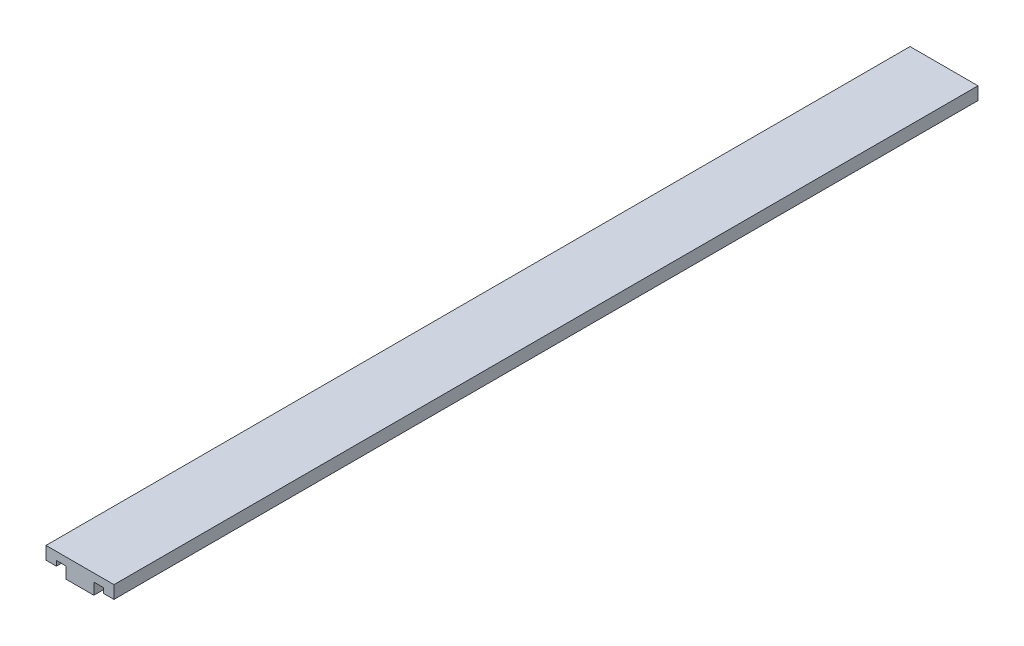
ISO-10303-21;
HEADER;
FILE_DESCRIPTION(('STEP AP214'),'2;1');
FILE_NAME('part.step','',(''),(''),'','','');
FILE_SCHEMA(('AUTOMOTIVE_DESIGN { 1 0 10303 214 1 1 1 1 }'));
ENDSEC;
DATA;
#1=APPLICATION_CONTEXT('core data for automotive mechanical design processes');
#2=APPLICATION_PROTOCOL_DEFINITION('international standard','automotive_design',2000,#1);
#3=PRODUCT_CONTEXT('',#1,'mechanical');
#4=PRODUCT('Part','Part','',(#3));
#5=PRODUCT_RELATED_PRODUCT_CATEGORY('part','',(#4));
#6=PRODUCT_DEFINITION_FORMATION('','',#4);
#7=PRODUCT_DEFINITION_CONTEXT('part definition',#1,'design');
#8=PRODUCT_DEFINITION('design','',#6,#7);
#9=PRODUCT_DEFINITION_SHAPE('','',#8);
#10=(LENGTH_UNIT() NAMED_UNIT(*) SI_UNIT(.MILLI.,.METRE.));
#11=(NAMED_UNIT(*) PLANE_ANGLE_UNIT() SI_UNIT($,.RADIAN.));
#12=(NAMED_UNIT(*) SI_UNIT($,.STERADIAN.) SOLID_ANGLE_UNIT());
#13=UNCERTAINTY_MEASURE_WITH_UNIT(LENGTH_MEASURE(1.E-05),#10,'distance_accuracy_value','');
#14=(GEOMETRIC_REPRESENTATION_CONTEXT(3) GLOBAL_UNCERTAINTY_ASSIGNED_CONTEXT((#13)) GLOBAL_UNIT_ASSIGNED_CONTEXT((#10,
#11,#12)) REPRESENTATION_CONTEXT('',''));
#15=CARTESIAN_POINT('',(0.,0.,0.));
#16=DIRECTION('',(0.,0.,1.));
#17=DIRECTION('',(1.,0.,0.));
#18=AXIS2_PLACEMENT_3D('',#15,#16,#17);
#19=CARTESIAN_POINT('',(-5.40005080000002,-33.5,-150.));
#20=DIRECTION('',(0.,-1.,0.));
#21=DIRECTION('',(0.,0.,-1.));
#22=AXIS2_PLACEMENT_3D('',#19,#20,#21);
#23=PLANE('',#22);
#24=DIRECTION('',(1.,0.,0.));
#25=VECTOR('',#24,1.);
#26=CARTESIAN_POINT('',(-5.40005080000002,-33.5,0.));
#27=LINE('',#26,#25);
#28=CARTESIAN_POINT('',(-5.40005080000002,-33.5,0.));
#29=VERTEX_POINT('',#28);
#30=CARTESIAN_POINT('',(-0.600050800000022,-33.5,0.));
#31=VERTEX_POINT('',#30);
#32=EDGE_CURVE('E154',#29,#31,#27,.T.);
#33=ORIENTED_EDGE('',*,*,#32,.F.);
#34=DIRECTION('',(0.,0.,1.));
#35=VECTOR('',#34,1.);
#36=CARTESIAN_POINT('',(-5.40005080000002,-33.5,-150.));
#37=LINE('',#36,#35);
#38=CARTESIAN_POINT('',(-5.40005080000002,-33.5,-150.));
#39=VERTEX_POINT('',#38);
#40=EDGE_CURVE('E11',#39,#29,#37,.T.);
#41=ORIENTED_EDGE('',*,*,#40,.F.);
#42=DIRECTION('',(1.,0.,0.));
#43=VECTOR('',#42,1.);
#44=CARTESIAN_POINT('',(-5.40005080000002,-33.5,-150.));
#45=LINE('',#44,#43);
#46=CARTESIAN_POINT('',(-0.600050800000022,-33.5,-150.));
#47=VERTEX_POINT('',#46);
#48=EDGE_CURVE('E186',#39,#47,#45,.T.);
#49=ORIENTED_EDGE('',*,*,#48,.T.);
#50=DIRECTION('',(0.,0.,1.));
#51=VECTOR('',#50,1.);
#52=CARTESIAN_POINT('',(-0.600050800000022,-33.5,-150.));
#53=LINE('',#52,#51);
#54=EDGE_CURVE('E36',#47,#31,#53,.T.);
#55=ORIENTED_EDGE('',*,*,#54,.T.);
#56=EDGE_LOOP('',(#33,#41,#49,#55));
#57=FACE_BOUND('',#56,.T.);
#58=ADVANCED_FACE('F33',(#57),#23,.T.);
#59=CARTESIAN_POINT('',(-5.40005080000002,-31.5104357389562,-150.));
#60=DIRECTION('',(-1.,0.,0.));
#61=DIRECTION('',(0.,0.,1.));
#62=AXIS2_PLACEMENT_3D('',#59,#60,#61);
#63=PLANE('',#62);
#64=DIRECTION('',(0.,-1.,0.));
#65=VECTOR('',#64,1.);
#66=CARTESIAN_POINT('',(-5.40005080000002,-31.5104357389562,0.));
#67=LINE('',#66,#65);
#68=CARTESIAN_POINT('',(-5.40005080000002,-31.5104357389562,0.));
#69=VERTEX_POINT('',#68);
#70=EDGE_CURVE('E184',#69,#29,#67,.T.);
#71=ORIENTED_EDGE('',*,*,#70,.F.);
#72=DIRECTION('',(0.,0.,1.));
#73=VECTOR('',#72,1.);
#74=CARTESIAN_POINT('',(-5.40005080000002,-31.5104357389562,-150.));
#75=LINE('',#74,#73);
#76=CARTESIAN_POINT('',(-5.40005080000002,-31.5104357389562,-150.));
#77=VERTEX_POINT('',#76);
#78=EDGE_CURVE('E42',#77,#69,#75,.T.);
#79=ORIENTED_EDGE('',*,*,#78,.F.);
#80=DIRECTION('',(0.,-1.,0.));
#81=VECTOR('',#80,1.);
#82=CARTESIAN_POINT('',(-5.40005080000002,-31.5104357389562,-150.));
#83=LINE('',#82,#81);
#84=EDGE_CURVE('E144',#77,#39,#83,.T.);
#85=ORIENTED_EDGE('',*,*,#84,.T.);
#86=ORIENTED_EDGE('',*,*,#40,.T.);
#87=EDGE_LOOP('',(#71,#79,#85,#86));
#88=FACE_BOUND('',#87,.T.);
#89=ADVANCED_FACE('F206',(#88),#63,.T.);
#90=CARTESIAN_POINT('',(-7.10005080000002,-31.5104357389562,-150.));
#91=DIRECTION('',(0.,-1.,0.));
#92=DIRECTION('',(0.,0.,-1.));
#93=AXIS2_PLACEMENT_3D('',#90,#91,#92);
#94=PLANE('',#93);
#95=DIRECTION('',(1.,0.,0.));
#96=VECTOR('',#95,1.);
#97=CARTESIAN_POINT('',(-7.10005080000002,-31.5104357389562,0.));
#98=LINE('',#97,#96);
#99=CARTESIAN_POINT('',(-7.10005080000002,-31.5104357389562,0.));
#100=VERTEX_POINT('',#99);
#101=EDGE_CURVE('E131',#100,#69,#98,.T.);
#102=ORIENTED_EDGE('',*,*,#101,.F.);
#103=DIRECTION('',(0.,0.,1.));
#104=VECTOR('',#103,1.);
#105=CARTESIAN_POINT('',(-7.10005080000002,-31.5104357389562,-150.));
#106=LINE('',#105,#104);
#107=CARTESIAN_POINT('',(-7.10005080000002,-31.5104357389562,-150.));
#108=VERTEX_POINT('',#107);
#109=EDGE_CURVE('E126',#108,#100,#106,.T.);
#110=ORIENTED_EDGE('',*,*,#109,.F.);
#111=DIRECTION('',(1.,0.,0.));
#112=VECTOR('',#111,1.);
#113=CARTESIAN_POINT('',(-7.10005080000002,-31.5104357389562,-150.));
#114=LINE('',#113,#112);
#115=EDGE_CURVE('E129',#108,#77,#114,.T.);
#116=ORIENTED_EDGE('',*,*,#115,.T.);
#117=ORIENTED_EDGE('',*,*,#78,.T.);
#118=EDGE_LOOP('',(#102,#110,#116,#117));
#119=FACE_BOUND('',#118,.T.);
#120=ADVANCED_FACE('F128',(#119),#94,.T.);
#121=CARTESIAN_POINT('',(-7.10005080000002,-32.3804332519096,-150.));
#122=DIRECTION('',(1.,0.,0.));
#123=DIRECTION('',(0.,0.,-1.));
#124=AXIS2_PLACEMENT_3D('',#121,#122,#123);
#125=PLANE('',#124);
#126=DIRECTION('',(0.,1.,0.));
#127=VECTOR('',#126,1.);
#128=CARTESIAN_POINT('',(-7.10005080000002,-32.3804332519096,0.));
#129=LINE('',#128,#127);
#130=CARTESIAN_POINT('',(-7.10005080000002,-32.3804332519096,0.));
#131=VERTEX_POINT('',#130);
#132=EDGE_CURVE('E181',#131,#100,#129,.T.);
#133=ORIENTED_EDGE('',*,*,#132,.F.);
#134=DIRECTION('',(0.,0.,1.));
#135=VECTOR('',#134,1.);
#136=CARTESIAN_POINT('',(-7.10005080000002,-32.3804332519096,-150.));
#137=LINE('',#136,#135);
#138=CARTESIAN_POINT('',(-7.10005080000002,-32.3804332519096,-150.));
#139=VERTEX_POINT('',#138);
#140=EDGE_CURVE('E136',#139,#131,#137,.T.);
#141=ORIENTED_EDGE('',*,*,#140,.F.);
#142=DIRECTION('',(0.,1.,0.));
#143=VECTOR('',#142,1.);
#144=CARTESIAN_POINT('',(-7.10005080000002,-32.3804332519096,-150.));
#145=LINE('',#144,#143);
#146=EDGE_CURVE('E142',#139,#108,#145,.T.);
#147=ORIENTED_EDGE('',*,*,#146,.T.);
#148=ORIENTED_EDGE('',*,*,#109,.T.);
#149=EDGE_LOOP('',(#133,#141,#147,#148));
#150=FACE_BOUND('',#149,.T.);
#151=ADVANCED_FACE('F146',(#150),#125,.T.);
#152=CARTESIAN_POINT('',(-8.90005080000002,-32.3804332519096,-150.));
#153=DIRECTION('',(0.,-1.,0.));
#154=DIRECTION('',(0.,0.,-1.));
#155=AXIS2_PLACEMENT_3D('',#152,#153,#154);
#156=PLANE('',#155);
#157=DIRECTION('',(1.,0.,0.));
#158=VECTOR('',#157,1.);
#159=CARTESIAN_POINT('',(-8.90005080000002,-32.3804332519096,0.));
#160=LINE('',#159,#158);
#161=CARTESIAN_POINT('',(-8.90005080000002,-32.3804332519096,0.));
#162=VERTEX_POINT('',#161);
#163=EDGE_CURVE('E178',#162,#131,#160,.T.);
#164=ORIENTED_EDGE('',*,*,#163,.F.);
#165=DIRECTION('',(0.,0.,1.));
#166=VECTOR('',#165,1.);
#167=CARTESIAN_POINT('',(-8.90005080000002,-32.3804332519096,-150.));
#168=LINE('',#167,#166);
#169=CARTESIAN_POINT('',(-8.90005080000002,-32.3804332519096,-150.));
#170=VERTEX_POINT('',#169);
#171=EDGE_CURVE('E190',#170,#162,#168,.T.);
#172=ORIENTED_EDGE('',*,*,#171,.F.);
#173=DIRECTION('',(1.,0.,0.));
#174=VECTOR('',#173,1.);
#175=CARTESIAN_POINT('',(-8.90005080000002,-32.3804332519096,-150.));
#176=LINE('',#175,#174);
#177=EDGE_CURVE('E147',#170,#139,#176,.T.);
#178=ORIENTED_EDGE('',*,*,#177,.T.);
#179=ORIENTED_EDGE('',*,*,#140,.T.);
#180=EDGE_LOOP('',(#164,#172,#178,#179));
#181=FACE_BOUND('',#180,.T.);
#182=ADVANCED_FACE('F219',(#181),#156,.T.);
#183=CARTESIAN_POINT('',(-8.90005080000002,-30.1504332519096,-150.));
#184=DIRECTION('',(-1.,0.,0.));
#185=DIRECTION('',(0.,0.,1.));
#186=AXIS2_PLACEMENT_3D('',#183,#184,#185);
#187=PLANE('',#186);
#188=DIRECTION('',(0.,-1.,0.));
#189=VECTOR('',#188,1.);
#190=CARTESIAN_POINT('',(-8.90005080000002,-30.1504332519096,0.));
#191=LINE('',#190,#189);
#192=CARTESIAN_POINT('',(-8.90005080000002,-30.1504332519096,0.));
#193=VERTEX_POINT('',#192);
#194=EDGE_CURVE('E175',#193,#162,#191,.T.);
#195=ORIENTED_EDGE('',*,*,#194,.F.);
#196=DIRECTION('',(0.,0.,1.));
#197=VECTOR('',#196,1.);
#198=CARTESIAN_POINT('',(-8.90005080000002,-30.1504332519096,-150.));
#199=LINE('',#198,#197);
#200=CARTESIAN_POINT('',(-8.90005080000002,-30.1504332519096,-150.));
#201=VERTEX_POINT('',#200);
#202=EDGE_CURVE('E192',#201,#193,#199,.T.);
#203=ORIENTED_EDGE('',*,*,#202,.F.);
#204=DIRECTION('',(0.,-1.,0.));
#205=VECTOR('',#204,1.);
#206=CARTESIAN_POINT('',(-8.90005080000002,-30.1504332519096,-150.));
#207=LINE('',#206,#205);
#208=EDGE_CURVE('E149',#201,#170,#207,.T.);
#209=ORIENTED_EDGE('',*,*,#208,.T.);
#210=ORIENTED_EDGE('',*,*,#171,.T.);
#211=EDGE_LOOP('',(#195,#203,#209,#210));
#212=FACE_BOUND('',#211,.T.);
#213=ADVANCED_FACE('F222',(#212),#187,.T.);
#214=CARTESIAN_POINT('',(2.89994919999997,-30.1504332519096,-150.));
#215=DIRECTION('',(0.,1.,0.));
#216=DIRECTION('',(0.,0.,1.));
#217=AXIS2_PLACEMENT_3D('',#214,#215,#216);
#218=PLANE('',#217);
#219=DIRECTION('',(-1.,0.,0.));
#220=VECTOR('',#219,1.);
#221=CARTESIAN_POINT('',(2.89994919999997,-30.1504332519096,0.));
#222=LINE('',#221,#220);
#223=CARTESIAN_POINT('',(2.89994919999997,-30.1504332519096,0.));
#224=VERTEX_POINT('',#223);
#225=EDGE_CURVE('E172',#224,#193,#222,.T.);
#226=ORIENTED_EDGE('',*,*,#225,.F.);
#227=DIRECTION('',(0.,0.,1.));
#228=VECTOR('',#227,1.);
#229=CARTESIAN_POINT('',(2.89994919999997,-30.1504332519096,-150.));
#230=LINE('',#229,#228);
#231=CARTESIAN_POINT('',(2.89994919999997,-30.1504332519096,-150.));
#232=VERTEX_POINT('',#231);
#233=EDGE_CURVE('E194',#232,#224,#230,.T.);
#234=ORIENTED_EDGE('',*,*,#233,.F.);
#235=DIRECTION('',(-1.,0.,0.));
#236=VECTOR('',#235,1.);
#237=CARTESIAN_POINT('',(2.89994919999997,-30.1504332519096,-150.));
#238=LINE('',#237,#236);
#239=EDGE_CURVE('E348',#232,#201,#238,.T.);
#240=ORIENTED_EDGE('',*,*,#239,.T.);
#241=ORIENTED_EDGE('',*,*,#202,.T.);
#242=EDGE_LOOP('',(#226,#234,#240,#241));
#243=FACE_BOUND('',#242,.T.);
#244=ADVANCED_FACE('F226',(#243),#218,.T.);
#245=CARTESIAN_POINT('',(2.89994919999997,-32.3804332519096,-150.));
#246=DIRECTION('',(1.,0.,0.));
#247=DIRECTION('',(0.,0.,-1.));
#248=AXIS2_PLACEMENT_3D('',#245,#246,#247);
#249=PLANE('',#248);
#250=DIRECTION('',(0.,1.,0.));
#251=VECTOR('',#250,1.);
#252=CARTESIAN_POINT('',(2.89994919999997,-32.3804332519096,0.));
#253=LINE('',#252,#251);
#254=CARTESIAN_POINT('',(2.89994919999997,-32.3804332519096,0.));
#255=VERTEX_POINT('',#254);
#256=EDGE_CURVE('E169',#255,#224,#253,.T.);
#257=ORIENTED_EDGE('',*,*,#256,.F.);
#258=DIRECTION('',(0.,0.,1.));
#259=VECTOR('',#258,1.);
#260=CARTESIAN_POINT('',(2.89994919999997,-32.3804332519096,-150.));
#261=LINE('',#260,#259);
#262=CARTESIAN_POINT('',(2.89994919999997,-32.3804332519096,-150.));
#263=VERTEX_POINT('',#262);
#264=EDGE_CURVE('E196',#263,#255,#261,.T.);
#265=ORIENTED_EDGE('',*,*,#264,.F.);
#266=DIRECTION('',(0.,1.,0.));
#267=VECTOR('',#266,1.);
#268=CARTESIAN_POINT('',(2.89994919999997,-32.3804332519096,-150.));
#269=LINE('',#268,#267);
#270=EDGE_CURVE('E352',#263,#232,#269,.T.);
#271=ORIENTED_EDGE('',*,*,#270,.T.);
#272=ORIENTED_EDGE('',*,*,#233,.T.);
#273=EDGE_LOOP('',(#257,#265,#271,#272));
#274=FACE_BOUND('',#273,.T.);
#275=ADVANCED_FACE('F230',(#274),#249,.T.);
#276=CARTESIAN_POINT('',(1.09994919999997,-32.3804332519096,-150.));
#277=DIRECTION('',(0.,-1.,0.));
#278=DIRECTION('',(0.,0.,-1.));
#279=AXIS2_PLACEMENT_3D('',#276,#277,#278);
#280=PLANE('',#279);
#281=DIRECTION('',(1.,0.,0.));
#282=VECTOR('',#281,1.);
#283=CARTESIAN_POINT('',(1.09994919999997,-32.3804332519096,0.));
#284=LINE('',#283,#282);
#285=CARTESIAN_POINT('',(1.09994919999997,-32.3804332519096,0.));
#286=VERTEX_POINT('',#285);
#287=EDGE_CURVE('E166',#286,#255,#284,.T.);
#288=ORIENTED_EDGE('',*,*,#287,.F.);
#289=DIRECTION('',(0.,0.,1.));
#290=VECTOR('',#289,1.);
#291=CARTESIAN_POINT('',(1.09994919999997,-32.3804332519096,-150.));
#292=LINE('',#291,#290);
#293=CARTESIAN_POINT('',(1.09994919999997,-32.3804332519096,-150.));
#294=VERTEX_POINT('',#293);
#295=EDGE_CURVE('E198',#294,#286,#292,.T.);
#296=ORIENTED_EDGE('',*,*,#295,.F.);
#297=DIRECTION('',(1.,0.,0.));
#298=VECTOR('',#297,1.);
#299=CARTESIAN_POINT('',(1.09994919999997,-32.3804332519096,-150.));
#300=LINE('',#299,#298);
#301=EDGE_CURVE('E341',#294,#263,#300,.T.);
#302=ORIENTED_EDGE('',*,*,#301,.T.);
#303=ORIENTED_EDGE('',*,*,#264,.T.);
#304=EDGE_LOOP('',(#288,#296,#302,#303));
#305=FACE_BOUND('',#304,.T.);
#306=ADVANCED_FACE('F234',(#305),#280,.T.);
#307=CARTESIAN_POINT('',(1.09994919999997,-32.3804332519096,-150.));
#308=DIRECTION('',(-1.,0.,0.));
#309=DIRECTION('',(0.,0.,1.));
#310=AXIS2_PLACEMENT_3D('',#307,#308,#309);
#311=PLANE('',#310);
#312=DIRECTION('',(0.,-1.,0.));
#313=VECTOR('',#312,1.);
#314=CARTESIAN_POINT('',(1.09994919999997,-32.3804332519096,0.));
#315=LINE('',#314,#313);
#316=CARTESIAN_POINT('',(1.09994919999997,-31.5124335046473,0.));
#317=VERTEX_POINT('',#316);
#318=EDGE_CURVE('E163',#317,#286,#315,.T.);
#319=ORIENTED_EDGE('',*,*,#318,.F.);
#320=DIRECTION('',(0.,0.,1.));
#321=VECTOR('',#320,1.);
#322=CARTESIAN_POINT('',(1.09994919999997,-31.5124335046473,-150.));
#323=LINE('',#322,#321);
#324=CARTESIAN_POINT('',(1.09994919999997,-31.5124335046473,-150.));
#325=VERTEX_POINT('',#324);
#326=EDGE_CURVE('E200',#325,#317,#323,.T.);
#327=ORIENTED_EDGE('',*,*,#326,.F.);
#328=DIRECTION('',(0.,-1.,0.));
#329=VECTOR('',#328,1.);
#330=CARTESIAN_POINT('',(1.09994919999997,-32.3804332519096,-150.));
#331=LINE('',#330,#329);
#332=EDGE_CURVE('E337',#325,#294,#331,.T.);
#333=ORIENTED_EDGE('',*,*,#332,.T.);
#334=ORIENTED_EDGE('',*,*,#295,.T.);
#335=EDGE_LOOP('',(#319,#327,#333,#334));
#336=FACE_BOUND('',#335,.T.);
#337=ADVANCED_FACE('F238',(#336),#311,.T.);
#338=CARTESIAN_POINT('',(1.09994919999997,-31.5124335046473,-150.));
#339=DIRECTION('',(0.,-1.,0.));
#340=DIRECTION('',(0.,0.,-1.));
#341=AXIS2_PLACEMENT_3D('',#338,#339,#340);
#342=PLANE('',#341);
#343=DIRECTION('',(1.,0.,0.));
#344=VECTOR('',#343,1.);
#345=CARTESIAN_POINT('',(1.09994919999997,-31.5124335046473,0.));
#346=LINE('',#345,#344);
#347=CARTESIAN_POINT('',(-0.600050800000022,-31.5124335046473,0.));
#348=VERTEX_POINT('',#347);
#349=EDGE_CURVE('E160',#348,#317,#346,.T.);
#350=ORIENTED_EDGE('',*,*,#349,.F.);
#351=DIRECTION('',(0.,0.,1.));
#352=VECTOR('',#351,1.);
#353=CARTESIAN_POINT('',(-0.600050800000022,-31.5124335046473,-150.));
#354=LINE('',#353,#352);
#355=CARTESIAN_POINT('',(-0.600050800000022,-31.5124335046473,-150.));
#356=VERTEX_POINT('',#355);
#357=EDGE_CURVE('E201',#356,#348,#354,.T.);
#358=ORIENTED_EDGE('',*,*,#357,.F.);
#359=DIRECTION('',(1.,0.,0.));
#360=VECTOR('',#359,1.);
#361=CARTESIAN_POINT('',(1.09994919999997,-31.5124335046473,-150.));
#362=LINE('',#361,#360);
#363=EDGE_CURVE('E358',#356,#325,#362,.T.);
#364=ORIENTED_EDGE('',*,*,#363,.T.);
#365=ORIENTED_EDGE('',*,*,#326,.T.);
#366=EDGE_LOOP('',(#350,#358,#364,#365));
#367=FACE_BOUND('',#366,.T.);
#368=ADVANCED_FACE('F242',(#367),#342,.T.);
#369=CARTESIAN_POINT('',(-0.600050800000022,-33.5,-150.));
#370=DIRECTION('',(1.,0.,0.));
#371=DIRECTION('',(0.,0.,-1.));
#372=AXIS2_PLACEMENT_3D('',#369,#370,#371);
#373=PLANE('',#372);
#374=DIRECTION('',(0.,1.,0.));
#375=VECTOR('',#374,1.);
#376=CARTESIAN_POINT('',(-0.600050800000022,-33.5,0.));
#377=LINE('',#376,#375);
#378=EDGE_CURVE('E157',#31,#348,#377,.T.);
#379=ORIENTED_EDGE('',*,*,#378,.F.);
#380=ORIENTED_EDGE('',*,*,#54,.F.);
#381=DIRECTION('',(0.,1.,0.));
#382=VECTOR('',#381,1.);
#383=CARTESIAN_POINT('',(-0.600050800000022,-33.5,-150.));
#384=LINE('',#383,#382);
#385=EDGE_CURVE('E360',#47,#356,#384,.T.);
#386=ORIENTED_EDGE('',*,*,#385,.T.);
#387=ORIENTED_EDGE('',*,*,#357,.T.);
#388=EDGE_LOOP('',(#379,#380,#386,#387));
#389=FACE_BOUND('',#388,.T.);
#390=ADVANCED_FACE('F203',(#389),#373,.T.);
#391=CARTESIAN_POINT('',(0.,0.,-150.));
#392=DIRECTION('',(0.,0.,1.));
#393=DIRECTION('',(1.,0.,0.));
#394=AXIS2_PLACEMENT_3D('',#391,#392,#393);
#395=PLANE('',#394);
#396=ORIENTED_EDGE('',*,*,#48,.F.);
#397=ORIENTED_EDGE('',*,*,#84,.F.);
#398=ORIENTED_EDGE('',*,*,#115,.F.);
#399=ORIENTED_EDGE('',*,*,#146,.F.);
#400=ORIENTED_EDGE('',*,*,#177,.F.);
#401=ORIENTED_EDGE('',*,*,#208,.F.);
#402=ORIENTED_EDGE('',*,*,#239,.F.);
#403=ORIENTED_EDGE('',*,*,#270,.F.);
#404=ORIENTED_EDGE('',*,*,#301,.F.);
#405=ORIENTED_EDGE('',*,*,#332,.F.);
#406=ORIENTED_EDGE('',*,*,#363,.F.);
#407=ORIENTED_EDGE('',*,*,#385,.F.);
#408=EDGE_LOOP('',(#396,#397,#398,#399,#400,#401,#402,#403,#404,#405,#406,#407));
#409=FACE_BOUND('',#408,.T.);
#410=ADVANCED_FACE('F140',(#409),#395,.F.);
#411=CARTESIAN_POINT('',(0.,0.,0.));
#412=DIRECTION('',(0.,0.,1.));
#413=DIRECTION('',(1.,0.,0.));
#414=AXIS2_PLACEMENT_3D('',#411,#412,#413);
#415=PLANE('',#414);
#416=ORIENTED_EDGE('',*,*,#32,.T.);
#417=ORIENTED_EDGE('',*,*,#378,.T.);
#418=ORIENTED_EDGE('',*,*,#349,.T.);
#419=ORIENTED_EDGE('',*,*,#318,.T.);
#420=ORIENTED_EDGE('',*,*,#287,.T.);
#421=ORIENTED_EDGE('',*,*,#256,.T.);
#422=ORIENTED_EDGE('',*,*,#225,.T.);
#423=ORIENTED_EDGE('',*,*,#194,.T.);
#424=ORIENTED_EDGE('',*,*,#163,.T.);
#425=ORIENTED_EDGE('',*,*,#132,.T.);
#426=ORIENTED_EDGE('',*,*,#101,.T.);
#427=ORIENTED_EDGE('',*,*,#70,.T.);
#428=EDGE_LOOP('',(#416,#417,#418,#419,#420,#421,#422,#423,#424,#425,#426,#427));
#429=FACE_BOUND('',#428,.T.);
#430=ADVANCED_FACE('F205',(#429),#415,.T.);
#431=CLOSED_SHELL('',(#58,#89,#120,#151,#182,#213,#244,#275,#306,#337,#368,#390,#410,#430));
#432=MANIFOLD_SOLID_BREP('B2',#431);
#433=ADVANCED_BREP_SHAPE_REPRESENTATION('',(#18,#432),#14);
#434=SHAPE_DEFINITION_REPRESENTATION(#9,#433);
ENDSEC;
END-ISO-10303-21;
